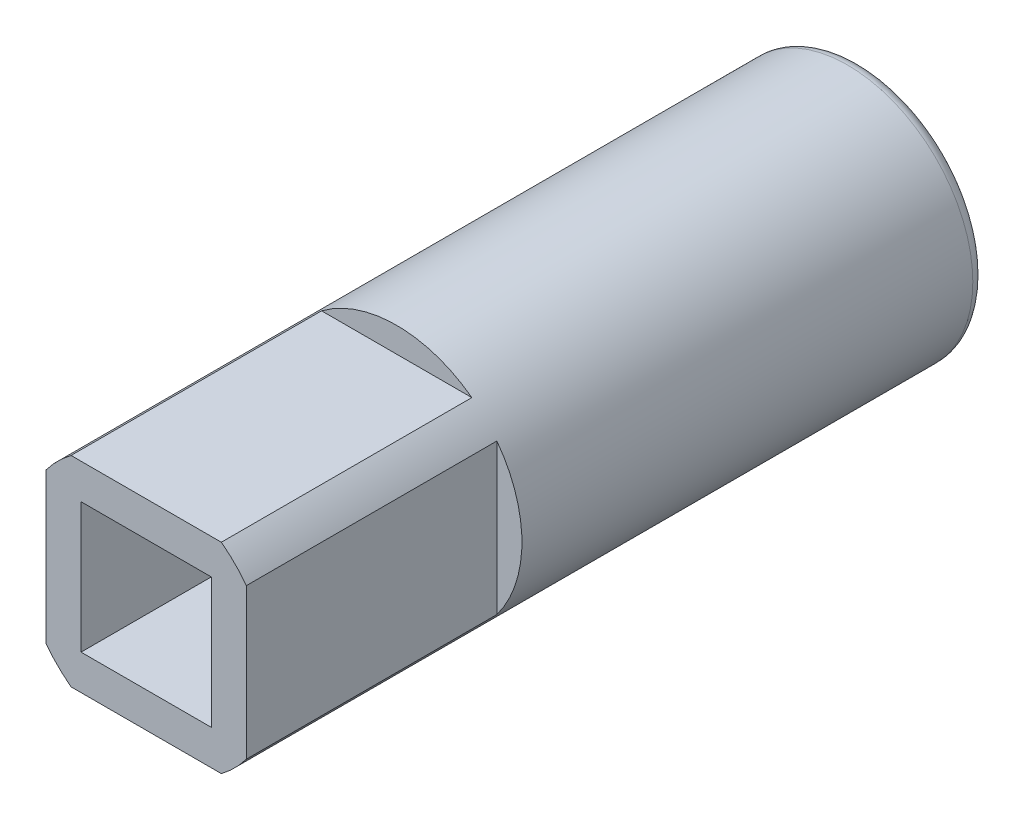
ISO-10303-21;
HEADER;
FILE_DESCRIPTION(('STEP AP214'),'2;1');
FILE_NAME('part.step','',(''),(''),'','','');
FILE_SCHEMA(('AUTOMOTIVE_DESIGN { 1 0 10303 214 1 1 1 1 }'));
ENDSEC;
DATA;
#1=APPLICATION_CONTEXT('core data for automotive mechanical design processes');
#2=APPLICATION_PROTOCOL_DEFINITION('international standard','automotive_design',2000,#1);
#3=PRODUCT_CONTEXT('',#1,'mechanical');
#4=PRODUCT('Part','Part','',(#3));
#5=PRODUCT_RELATED_PRODUCT_CATEGORY('part','',(#4));
#6=PRODUCT_DEFINITION_FORMATION('','',#4);
#7=PRODUCT_DEFINITION_CONTEXT('part definition',#1,'design');
#8=PRODUCT_DEFINITION('design','',#6,#7);
#9=PRODUCT_DEFINITION_SHAPE('','',#8);
#10=(LENGTH_UNIT() NAMED_UNIT(*) SI_UNIT(.MILLI.,.METRE.));
#11=(NAMED_UNIT(*) PLANE_ANGLE_UNIT() SI_UNIT($,.RADIAN.));
#12=(NAMED_UNIT(*) SI_UNIT($,.STERADIAN.) SOLID_ANGLE_UNIT());
#13=UNCERTAINTY_MEASURE_WITH_UNIT(LENGTH_MEASURE(1.E-05),#10,'distance_accuracy_value','');
#14=(GEOMETRIC_REPRESENTATION_CONTEXT(3) GLOBAL_UNCERTAINTY_ASSIGNED_CONTEXT((#13)) GLOBAL_UNIT_ASSIGNED_CONTEXT((#10,
#11,#12)) REPRESENTATION_CONTEXT('',''));
#15=CARTESIAN_POINT('',(0.,0.,0.));
#16=DIRECTION('',(0.,0.,1.));
#17=DIRECTION('',(1.,0.,0.));
#18=AXIS2_PLACEMENT_3D('',#15,#16,#17);
#19=CARTESIAN_POINT('',(0.,0.,18.5));
#20=DIRECTION('',(0.,0.,1.));
#21=DIRECTION('',(1.,0.,0.));
#22=AXIS2_PLACEMENT_3D('',#19,#20,#21);
#23=PLANE('',#22);
#24=CARTESIAN_POINT('',(0.,0.,18.5));
#25=DIRECTION('',(0.,0.,1.));
#26=DIRECTION('',(1.,0.,0.));
#27=AXIS2_PLACEMENT_3D('',#24,#25,#26);
#28=CIRCLE('',#27,5.);
#29=CARTESIAN_POINT('',(-4.,3.,18.5));
#30=VERTEX_POINT('',#29);
#31=CARTESIAN_POINT('',(-4.,-3.,18.5));
#32=VERTEX_POINT('',#31);
#33=EDGE_CURVE('E262',#30,#32,#28,.T.);
#34=ORIENTED_EDGE('',*,*,#33,.T.);
#35=DIRECTION('',(0.,1.,0.));
#36=VECTOR('',#35,1.);
#37=CARTESIAN_POINT('',(-4.,0.,18.5));
#38=LINE('',#37,#36);
#39=EDGE_CURVE('E213',#32,#30,#38,.T.);
#40=ORIENTED_EDGE('',*,*,#39,.T.);
#41=EDGE_LOOP('',(#34,#40));
#42=FACE_BOUND('',#41,.T.);
#43=ADVANCED_FACE('F50',(#42),#23,.T.);
#44=CARTESIAN_POINT('',(3.,4.,18.5));
#45=VERTEX_POINT('',#44);
#46=CARTESIAN_POINT('',(-3.,4.,18.5));
#47=VERTEX_POINT('',#46);
#48=EDGE_CURVE('E253',#45,#47,#28,.T.);
#49=ORIENTED_EDGE('',*,*,#48,.T.);
#50=DIRECTION('',(1.,0.,0.));
#51=VECTOR('',#50,1.);
#52=CARTESIAN_POINT('',(0.,4.,18.5));
#53=LINE('',#52,#51);
#54=EDGE_CURVE('E215',#47,#45,#53,.T.);
#55=ORIENTED_EDGE('',*,*,#54,.T.);
#56=EDGE_LOOP('',(#49,#55));
#57=FACE_BOUND('',#56,.T.);
#58=ADVANCED_FACE('F297',(#57),#23,.T.);
#59=DIRECTION('',(1.,0.,0.));
#60=VECTOR('',#59,1.);
#61=CARTESIAN_POINT('',(0.,-4.,18.5));
#62=LINE('',#61,#60);
#63=CARTESIAN_POINT('',(-3.,-4.,18.5));
#64=VERTEX_POINT('',#63);
#65=CARTESIAN_POINT('',(3.,-4.,18.5));
#66=VERTEX_POINT('',#65);
#67=EDGE_CURVE('E195',#64,#66,#62,.T.);
#68=ORIENTED_EDGE('',*,*,#67,.F.);
#69=EDGE_CURVE('E251',#64,#66,#28,.T.);
#70=ORIENTED_EDGE('',*,*,#69,.T.);
#71=EDGE_LOOP('',(#68,#70));
#72=FACE_BOUND('',#71,.T.);
#73=ADVANCED_FACE('F270',(#72),#23,.T.);
#74=CARTESIAN_POINT('',(0.,0.,18.5));
#75=DIRECTION('',(0.,0.,-1.));
#76=DIRECTION('',(-1.,0.,0.));
#77=AXIS2_PLACEMENT_3D('',#74,#75,#76);
#78=CYLINDRICAL_SURFACE('',#77,5.);
#79=CARTESIAN_POINT('',(0.,0.,0.5));
#80=DIRECTION('',(0.,0.,1.));
#81=DIRECTION('',(1.,0.,0.));
#82=AXIS2_PLACEMENT_3D('',#79,#80,#81);
#83=CIRCLE('',#82,5.);
#84=CARTESIAN_POINT('',(5.,0.,0.5));
#85=VERTEX_POINT('',#84);
#86=EDGE_CURVE('E57',#85,#85,#83,.T.);
#87=ORIENTED_EDGE('',*,*,#86,.T.);
#88=EDGE_LOOP('',(#87));
#89=FACE_BOUND('',#88,.T.);
#90=ORIENTED_EDGE('',*,*,#48,.F.);
#91=DIRECTION('',(0.,0.,-1.));
#92=VECTOR('',#91,1.);
#93=CARTESIAN_POINT('',(3.,4.,28.5));
#94=LINE('',#93,#92);
#95=CARTESIAN_POINT('',(3.,4.,28.5));
#96=VERTEX_POINT('',#95);
#97=EDGE_CURVE('E239',#96,#45,#94,.T.);
#98=ORIENTED_EDGE('',*,*,#97,.F.);
#99=CARTESIAN_POINT('',(0.,0.,28.5));
#100=DIRECTION('',(0.,0.,1.));
#101=DIRECTION('',(1.,0.,0.));
#102=AXIS2_PLACEMENT_3D('',#99,#100,#101);
#103=CIRCLE('',#102,5.);
#104=CARTESIAN_POINT('',(4.,3.,28.5));
#105=VERTEX_POINT('',#104);
#106=EDGE_CURVE('E191',#105,#96,#103,.T.);
#107=ORIENTED_EDGE('',*,*,#106,.F.);
#108=DIRECTION('',(0.,0.,-1.));
#109=VECTOR('',#108,1.);
#110=CARTESIAN_POINT('',(4.,3.,28.5));
#111=LINE('',#110,#109);
#112=CARTESIAN_POINT('',(4.,3.,18.5));
#113=VERTEX_POINT('',#112);
#114=EDGE_CURVE('E242',#105,#113,#111,.T.);
#115=ORIENTED_EDGE('',*,*,#114,.T.);
#116=CARTESIAN_POINT('',(4.,-3.,18.5));
#117=VERTEX_POINT('',#116);
#118=EDGE_CURVE('E255',#117,#113,#28,.T.);
#119=ORIENTED_EDGE('',*,*,#118,.F.);
#120=DIRECTION('',(0.,0.,-1.));
#121=VECTOR('',#120,1.);
#122=CARTESIAN_POINT('',(4.,-3.,28.5));
#123=LINE('',#122,#121);
#124=CARTESIAN_POINT('',(4.,-3.,28.5));
#125=VERTEX_POINT('',#124);
#126=EDGE_CURVE('E247',#125,#117,#123,.T.);
#127=ORIENTED_EDGE('',*,*,#126,.F.);
#128=CARTESIAN_POINT('',(3.,-4.,28.5));
#129=VERTEX_POINT('',#128);
#130=EDGE_CURVE('E190',#129,#125,#103,.T.);
#131=ORIENTED_EDGE('',*,*,#130,.F.);
#132=DIRECTION('',(0.,0.,-1.));
#133=VECTOR('',#132,1.);
#134=CARTESIAN_POINT('',(3.,-4.,28.5));
#135=LINE('',#134,#133);
#136=EDGE_CURVE('E209',#129,#66,#135,.T.);
#137=ORIENTED_EDGE('',*,*,#136,.T.);
#138=ORIENTED_EDGE('',*,*,#69,.F.);
#139=DIRECTION('',(0.,0.,-1.));
#140=VECTOR('',#139,1.);
#141=CARTESIAN_POINT('',(-3.,-4.,28.5));
#142=LINE('',#141,#140);
#143=CARTESIAN_POINT('',(-3.,-4.,28.5));
#144=VERTEX_POINT('',#143);
#145=EDGE_CURVE('E223',#144,#64,#142,.T.);
#146=ORIENTED_EDGE('',*,*,#145,.F.);
#147=CARTESIAN_POINT('',(-4.,-3.,28.5));
#148=VERTEX_POINT('',#147);
#149=EDGE_CURVE('E194',#148,#144,#103,.T.);
#150=ORIENTED_EDGE('',*,*,#149,.F.);
#151=DIRECTION('',(0.,0.,-1.));
#152=VECTOR('',#151,1.);
#153=CARTESIAN_POINT('',(-4.,-3.,28.5));
#154=LINE('',#153,#152);
#155=EDGE_CURVE('E226',#148,#32,#154,.T.);
#156=ORIENTED_EDGE('',*,*,#155,.T.);
#157=ORIENTED_EDGE('',*,*,#33,.F.);
#158=DIRECTION('',(0.,0.,-1.));
#159=VECTOR('',#158,1.);
#160=CARTESIAN_POINT('',(-4.,3.,28.5));
#161=LINE('',#160,#159);
#162=CARTESIAN_POINT('',(-4.,3.,28.5));
#163=VERTEX_POINT('',#162);
#164=EDGE_CURVE('E235',#163,#30,#161,.T.);
#165=ORIENTED_EDGE('',*,*,#164,.F.);
#166=CARTESIAN_POINT('',(-3.,4.,28.5));
#167=VERTEX_POINT('',#166);
#168=EDGE_CURVE('E201',#167,#163,#103,.T.);
#169=ORIENTED_EDGE('',*,*,#168,.F.);
#170=DIRECTION('',(0.,0.,-1.));
#171=VECTOR('',#170,1.);
#172=CARTESIAN_POINT('',(-3.,4.,28.5));
#173=LINE('',#172,#171);
#174=EDGE_CURVE('E236',#167,#47,#173,.T.);
#175=ORIENTED_EDGE('',*,*,#174,.T.);
#176=EDGE_LOOP('',(#90,#98,#107,#115,#119,#127,#131,#137,#138,#146,#150,#156,#157,#165,#169,#175));
#177=FACE_BOUND('',#176,.T.);
#178=ADVANCED_FACE('F279',(#89,#177),#78,.T.);
#179=DIRECTION('',(0.,1.,0.));
#180=VECTOR('',#179,1.);
#181=CARTESIAN_POINT('',(4.,0.,18.5));
#182=LINE('',#181,#180);
#183=EDGE_CURVE('E68',#117,#113,#182,.T.);
#184=ORIENTED_EDGE('',*,*,#183,.F.);
#185=ORIENTED_EDGE('',*,*,#118,.T.);
#186=EDGE_LOOP('',(#184,#185));
#187=FACE_BOUND('',#186,.T.);
#188=ADVANCED_FACE('F305',(#187),#23,.T.);
#189=CARTESIAN_POINT('',(0.,0.,0.));
#190=DIRECTION('',(0.,0.,1.));
#191=DIRECTION('',(1.,0.,0.));
#192=AXIS2_PLACEMENT_3D('',#189,#190,#191);
#193=PLANE('',#192);
#194=CARTESIAN_POINT('',(0.,0.,0.));
#195=DIRECTION('',(0.,0.,1.));
#196=DIRECTION('',(1.,0.,0.));
#197=AXIS2_PLACEMENT_3D('',#194,#195,#196);
#198=CIRCLE('',#197,4.5);
#199=CARTESIAN_POINT('',(4.5,0.,0.));
#200=VERTEX_POINT('',#199);
#201=EDGE_CURVE('E11',#200,#200,#198,.F.);
#202=ORIENTED_EDGE('',*,*,#201,.T.);
#203=EDGE_LOOP('',(#202));
#204=FACE_BOUND('',#203,.T.);
#205=ADVANCED_FACE('F307',(#204),#193,.F.);
#206=CARTESIAN_POINT('',(4.,0.,28.5));
#207=DIRECTION('',(-1.,0.,0.));
#208=DIRECTION('',(0.,0.,1.));
#209=AXIS2_PLACEMENT_3D('',#206,#207,#208);
#210=PLANE('',#209);
#211=ORIENTED_EDGE('',*,*,#183,.T.);
#212=ORIENTED_EDGE('',*,*,#114,.F.);
#213=DIRECTION('',(0.,1.,0.));
#214=VECTOR('',#213,1.);
#215=CARTESIAN_POINT('',(4.,0.,28.5));
#216=LINE('',#215,#214);
#217=EDGE_CURVE('E192',#125,#105,#216,.T.);
#218=ORIENTED_EDGE('',*,*,#217,.F.);
#219=ORIENTED_EDGE('',*,*,#126,.T.);
#220=EDGE_LOOP('',(#211,#212,#218,#219));
#221=FACE_BOUND('',#220,.T.);
#222=ADVANCED_FACE('F314',(#221),#210,.F.);
#223=CARTESIAN_POINT('',(0.,4.,28.5));
#224=DIRECTION('',(0.,1.,0.));
#225=DIRECTION('',(0.,0.,1.));
#226=AXIS2_PLACEMENT_3D('',#223,#224,#225);
#227=PLANE('',#226);
#228=ORIENTED_EDGE('',*,*,#54,.F.);
#229=ORIENTED_EDGE('',*,*,#174,.F.);
#230=DIRECTION('',(1.,0.,0.));
#231=VECTOR('',#230,1.);
#232=CARTESIAN_POINT('',(0.,4.,28.5));
#233=LINE('',#232,#231);
#234=EDGE_CURVE('E200',#167,#96,#233,.T.);
#235=ORIENTED_EDGE('',*,*,#234,.T.);
#236=ORIENTED_EDGE('',*,*,#97,.T.);
#237=EDGE_LOOP('',(#228,#229,#235,#236));
#238=FACE_BOUND('',#237,.T.);
#239=ADVANCED_FACE('F294',(#238),#227,.T.);
#240=CARTESIAN_POINT('',(-4.,0.,28.5));
#241=DIRECTION('',(-1.,0.,0.));
#242=DIRECTION('',(0.,0.,1.));
#243=AXIS2_PLACEMENT_3D('',#240,#241,#242);
#244=PLANE('',#243);
#245=ORIENTED_EDGE('',*,*,#39,.F.);
#246=ORIENTED_EDGE('',*,*,#155,.F.);
#247=DIRECTION('',(0.,1.,0.));
#248=VECTOR('',#247,1.);
#249=CARTESIAN_POINT('',(-4.,0.,28.5));
#250=LINE('',#249,#248);
#251=EDGE_CURVE('E202',#148,#163,#250,.T.);
#252=ORIENTED_EDGE('',*,*,#251,.T.);
#253=ORIENTED_EDGE('',*,*,#164,.T.);
#254=EDGE_LOOP('',(#245,#246,#252,#253));
#255=FACE_BOUND('',#254,.T.);
#256=ADVANCED_FACE('F296',(#255),#244,.T.);
#257=CARTESIAN_POINT('',(0.,-4.,28.5));
#258=DIRECTION('',(0.,1.,0.));
#259=DIRECTION('',(0.,0.,1.));
#260=AXIS2_PLACEMENT_3D('',#257,#258,#259);
#261=PLANE('',#260);
#262=ORIENTED_EDGE('',*,*,#67,.T.);
#263=ORIENTED_EDGE('',*,*,#136,.F.);
#264=DIRECTION('',(1.,0.,0.));
#265=VECTOR('',#264,1.);
#266=CARTESIAN_POINT('',(0.,-4.,28.5));
#267=LINE('',#266,#265);
#268=EDGE_CURVE('E207',#144,#129,#267,.T.);
#269=ORIENTED_EDGE('',*,*,#268,.F.);
#270=ORIENTED_EDGE('',*,*,#145,.T.);
#271=EDGE_LOOP('',(#262,#263,#269,#270));
#272=FACE_BOUND('',#271,.T.);
#273=ADVANCED_FACE('F273',(#272),#261,.F.);
#274=CARTESIAN_POINT('',(0.,0.,28.5));
#275=DIRECTION('',(0.,0.,1.));
#276=DIRECTION('',(1.,0.,0.));
#277=AXIS2_PLACEMENT_3D('',#274,#275,#276);
#278=PLANE('',#277);
#279=DIRECTION('',(0.,1.,0.));
#280=VECTOR('',#279,1.);
#281=CARTESIAN_POINT('',(2.6,-2.6,28.5));
#282=LINE('',#281,#280);
#283=CARTESIAN_POINT('',(2.6,-2.6,28.5));
#284=VERTEX_POINT('',#283);
#285=CARTESIAN_POINT('',(2.6,2.6,28.5));
#286=VERTEX_POINT('',#285);
#287=EDGE_CURVE('E64',#284,#286,#282,.T.);
#288=ORIENTED_EDGE('',*,*,#287,.F.);
#289=DIRECTION('',(1.,0.,0.));
#290=VECTOR('',#289,1.);
#291=CARTESIAN_POINT('',(-2.6,-2.6,28.5));
#292=LINE('',#291,#290);
#293=CARTESIAN_POINT('',(-2.6,-2.6,28.5));
#294=VERTEX_POINT('',#293);
#295=EDGE_CURVE('E160',#294,#284,#292,.T.);
#296=ORIENTED_EDGE('',*,*,#295,.F.);
#297=DIRECTION('',(0.,-1.,0.));
#298=VECTOR('',#297,1.);
#299=CARTESIAN_POINT('',(-2.6,-2.6,28.5));
#300=LINE('',#299,#298);
#301=CARTESIAN_POINT('',(-2.6,2.6,28.5));
#302=VERTEX_POINT('',#301);
#303=EDGE_CURVE('E165',#302,#294,#300,.T.);
#304=ORIENTED_EDGE('',*,*,#303,.F.);
#305=DIRECTION('',(-1.,0.,0.));
#306=VECTOR('',#305,1.);
#307=CARTESIAN_POINT('',(-2.6,2.6,28.5));
#308=LINE('',#307,#306);
#309=EDGE_CURVE('E173',#286,#302,#308,.T.);
#310=ORIENTED_EDGE('',*,*,#309,.F.);
#311=EDGE_LOOP('',(#288,#296,#304,#310));
#312=FACE_BOUND('',#311,.T.);
#313=ORIENTED_EDGE('',*,*,#130,.T.);
#314=ORIENTED_EDGE('',*,*,#217,.T.);
#315=ORIENTED_EDGE('',*,*,#106,.T.);
#316=ORIENTED_EDGE('',*,*,#234,.F.);
#317=ORIENTED_EDGE('',*,*,#168,.T.);
#318=ORIENTED_EDGE('',*,*,#251,.F.);
#319=ORIENTED_EDGE('',*,*,#149,.T.);
#320=ORIENTED_EDGE('',*,*,#268,.T.);
#321=EDGE_LOOP('',(#313,#314,#315,#316,#317,#318,#319,#320));
#322=FACE_BOUND('',#321,.T.);
#323=ADVANCED_FACE('F282',(#312,#322),#278,.T.);
#324=CARTESIAN_POINT('',(2.6,-2.6,18.5));
#325=DIRECTION('',(1.,0.,0.));
#326=DIRECTION('',(0.,0.,-1.));
#327=AXIS2_PLACEMENT_3D('',#324,#325,#326);
#328=PLANE('',#327);
#329=ORIENTED_EDGE('',*,*,#287,.T.);
#330=DIRECTION('',(0.,0.,1.));
#331=VECTOR('',#330,1.);
#332=CARTESIAN_POINT('',(2.6,2.6,18.5));
#333=LINE('',#332,#331);
#334=CARTESIAN_POINT('',(2.6,2.6,18.5));
#335=VERTEX_POINT('',#334);
#336=EDGE_CURVE('E133',#335,#286,#333,.T.);
#337=ORIENTED_EDGE('',*,*,#336,.F.);
#338=DIRECTION('',(0.,1.,0.));
#339=VECTOR('',#338,1.);
#340=CARTESIAN_POINT('',(2.6,-2.6,18.5));
#341=LINE('',#340,#339);
#342=CARTESIAN_POINT('',(2.6,-2.6,18.5));
#343=VERTEX_POINT('',#342);
#344=EDGE_CURVE('E138',#343,#335,#341,.T.);
#345=ORIENTED_EDGE('',*,*,#344,.F.);
#346=DIRECTION('',(0.,0.,1.));
#347=VECTOR('',#346,1.);
#348=CARTESIAN_POINT('',(2.6,-2.6,18.5));
#349=LINE('',#348,#347);
#350=EDGE_CURVE('E177',#343,#284,#349,.T.);
#351=ORIENTED_EDGE('',*,*,#350,.T.);
#352=EDGE_LOOP('',(#329,#337,#345,#351));
#353=FACE_BOUND('',#352,.T.);
#354=ADVANCED_FACE('F137',(#353),#328,.F.);
#355=CARTESIAN_POINT('',(-2.6,-2.6,18.5));
#356=DIRECTION('',(0.,-1.,0.));
#357=DIRECTION('',(0.,0.,-1.));
#358=AXIS2_PLACEMENT_3D('',#355,#356,#357);
#359=PLANE('',#358);
#360=ORIENTED_EDGE('',*,*,#295,.T.);
#361=ORIENTED_EDGE('',*,*,#350,.F.);
#362=DIRECTION('',(1.,0.,0.));
#363=VECTOR('',#362,1.);
#364=CARTESIAN_POINT('',(-2.6,-2.6,18.5));
#365=LINE('',#364,#363);
#366=CARTESIAN_POINT('',(-2.6,-2.6,18.5));
#367=VERTEX_POINT('',#366);
#368=EDGE_CURVE('E147',#367,#343,#365,.T.);
#369=ORIENTED_EDGE('',*,*,#368,.F.);
#370=DIRECTION('',(0.,0.,1.));
#371=VECTOR('',#370,1.);
#372=CARTESIAN_POINT('',(-2.6,-2.6,18.5));
#373=LINE('',#372,#371);
#374=EDGE_CURVE('E185',#367,#294,#373,.T.);
#375=ORIENTED_EDGE('',*,*,#374,.T.);
#376=EDGE_LOOP('',(#360,#361,#369,#375));
#377=FACE_BOUND('',#376,.T.);
#378=ADVANCED_FACE('F415',(#377),#359,.F.);
#379=CARTESIAN_POINT('',(-2.6,-2.6,18.5));
#380=DIRECTION('',(-1.,0.,0.));
#381=DIRECTION('',(0.,0.,1.));
#382=AXIS2_PLACEMENT_3D('',#379,#380,#381);
#383=PLANE('',#382);
#384=ORIENTED_EDGE('',*,*,#303,.T.);
#385=ORIENTED_EDGE('',*,*,#374,.F.);
#386=DIRECTION('',(0.,-1.,0.));
#387=VECTOR('',#386,1.);
#388=CARTESIAN_POINT('',(-2.6,-2.6,18.5));
#389=LINE('',#388,#387);
#390=CARTESIAN_POINT('',(-2.6,2.6,18.5));
#391=VERTEX_POINT('',#390);
#392=EDGE_CURVE('E153',#391,#367,#389,.T.);
#393=ORIENTED_EDGE('',*,*,#392,.F.);
#394=DIRECTION('',(0.,0.,1.));
#395=VECTOR('',#394,1.);
#396=CARTESIAN_POINT('',(-2.6,2.6,18.5));
#397=LINE('',#396,#395);
#398=EDGE_CURVE('E143',#391,#302,#397,.T.);
#399=ORIENTED_EDGE('',*,*,#398,.T.);
#400=EDGE_LOOP('',(#384,#385,#393,#399));
#401=FACE_BOUND('',#400,.T.);
#402=ADVANCED_FACE('F423',(#401),#383,.F.);
#403=CARTESIAN_POINT('',(-2.6,2.6,18.5));
#404=DIRECTION('',(0.,1.,0.));
#405=DIRECTION('',(0.,0.,1.));
#406=AXIS2_PLACEMENT_3D('',#403,#404,#405);
#407=PLANE('',#406);
#408=ORIENTED_EDGE('',*,*,#309,.T.);
#409=ORIENTED_EDGE('',*,*,#398,.F.);
#410=DIRECTION('',(-1.,0.,0.));
#411=VECTOR('',#410,1.);
#412=CARTESIAN_POINT('',(-2.6,2.6,18.5));
#413=LINE('',#412,#411);
#414=EDGE_CURVE('E146',#335,#391,#413,.T.);
#415=ORIENTED_EDGE('',*,*,#414,.F.);
#416=ORIENTED_EDGE('',*,*,#336,.T.);
#417=EDGE_LOOP('',(#408,#409,#415,#416));
#418=FACE_BOUND('',#417,.T.);
#419=ADVANCED_FACE('F148',(#418),#407,.F.);
#420=CARTESIAN_POINT('',(0.,0.,18.5));
#421=DIRECTION('',(0.,0.,-1.));
#422=DIRECTION('',(-1.,0.,0.));
#423=AXIS2_PLACEMENT_3D('',#420,#421,#422);
#424=PLANE('',#423);
#425=ORIENTED_EDGE('',*,*,#344,.T.);
#426=ORIENTED_EDGE('',*,*,#414,.T.);
#427=ORIENTED_EDGE('',*,*,#392,.T.);
#428=ORIENTED_EDGE('',*,*,#368,.T.);
#429=EDGE_LOOP('',(#425,#426,#427,#428));
#430=FACE_BOUND('',#429,.T.);
#431=ADVANCED_FACE('F157',(#430),#424,.F.);
#432=CARTESIAN_POINT('',(0.,0.,0.5));
#433=DIRECTION('',(0.,0.,1.));
#434=DIRECTION('',(1.,0.,0.));
#435=AXIS2_PLACEMENT_3D('',#432,#433,#434);
#436=TOROIDAL_SURFACE('',#435,4.5,0.5);
#437=ORIENTED_EDGE('',*,*,#201,.F.);
#438=EDGE_LOOP('',(#437));
#439=FACE_BOUND('',#438,.T.);
#440=ORIENTED_EDGE('',*,*,#86,.F.);
#441=EDGE_LOOP('',(#440));
#442=FACE_BOUND('',#441,.T.);
#443=ADVANCED_FACE('F47',(#439,#442),#436,.T.);
#444=CLOSED_SHELL('',(#43,#58,#73,#178,#188,#205,#222,#239,#256,#273,#323,#354,#378,#402,#419,
#431,#443));
#445=MANIFOLD_SOLID_BREP('B2',#444);
#446=ADVANCED_BREP_SHAPE_REPRESENTATION('',(#18,#445),#14);
#447=SHAPE_DEFINITION_REPRESENTATION(#9,#446);
ENDSEC;
END-ISO-10303-21;
